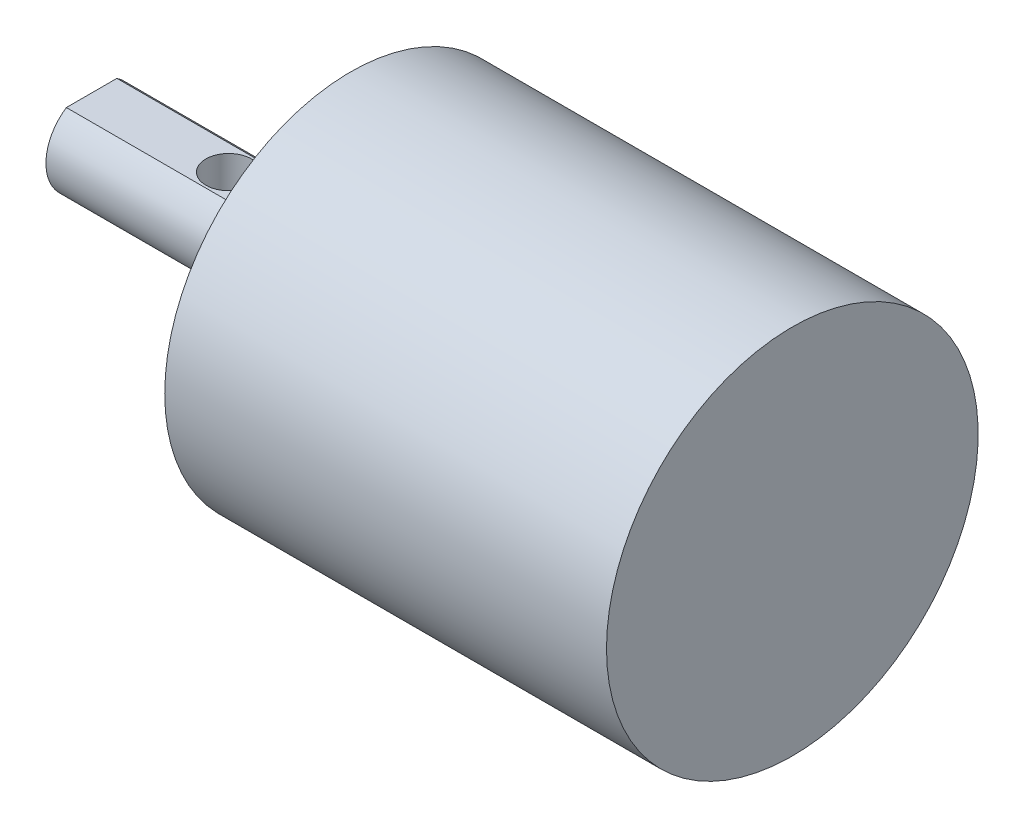
ISO-10303-21;
HEADER;
FILE_DESCRIPTION(('STEP AP214'),'2;1');
FILE_NAME('part.step','',(''),(''),'','','');
FILE_SCHEMA(('AUTOMOTIVE_DESIGN { 1 0 10303 214 1 1 1 1 }'));
ENDSEC;
DATA;
#1=APPLICATION_CONTEXT('core data for automotive mechanical design processes');
#2=APPLICATION_PROTOCOL_DEFINITION('international standard','automotive_design',2000,#1);
#3=PRODUCT_CONTEXT('',#1,'mechanical');
#4=PRODUCT('Part','Part','',(#3));
#5=PRODUCT_RELATED_PRODUCT_CATEGORY('part','',(#4));
#6=PRODUCT_DEFINITION_FORMATION('','',#4);
#7=PRODUCT_DEFINITION_CONTEXT('part definition',#1,'design');
#8=PRODUCT_DEFINITION('design','',#6,#7);
#9=PRODUCT_DEFINITION_SHAPE('','',#8);
#10=(LENGTH_UNIT() NAMED_UNIT(*) SI_UNIT(.MILLI.,.METRE.));
#11=(NAMED_UNIT(*) PLANE_ANGLE_UNIT() SI_UNIT($,.RADIAN.));
#12=(NAMED_UNIT(*) SI_UNIT($,.STERADIAN.) SOLID_ANGLE_UNIT());
#13=UNCERTAINTY_MEASURE_WITH_UNIT(LENGTH_MEASURE(1.E-05),#10,'distance_accuracy_value','');
#14=(GEOMETRIC_REPRESENTATION_CONTEXT(3) GLOBAL_UNCERTAINTY_ASSIGNED_CONTEXT((#13)) GLOBAL_UNIT_ASSIGNED_CONTEXT((#10,
#11,#12)) REPRESENTATION_CONTEXT('',''));
#15=CARTESIAN_POINT('',(0.,0.,0.));
#16=DIRECTION('',(0.,0.,1.));
#17=DIRECTION('',(1.,0.,0.));
#18=AXIS2_PLACEMENT_3D('',#15,#16,#17);
#19=CARTESIAN_POINT('',(-31.6,0.,-5.7));
#20=DIRECTION('',(-1.,0.,0.));
#21=DIRECTION('',(0.,0.,1.));
#22=AXIS2_PLACEMENT_3D('',#19,#20,#21);
#23=PLANE('',#22);
#24=CARTESIAN_POINT('',(-31.6,0.,-12.2));
#25=DIRECTION('',(-1.,0.,0.));
#26=DIRECTION('',(0.,0.,1.));
#27=AXIS2_PLACEMENT_3D('',#24,#25,#26);
#28=CIRCLE('',#27,6.5);
#29=CARTESIAN_POINT('',(-31.6,0.,-5.7));
#30=VERTEX_POINT('',#29);
#31=EDGE_CURVE('E234',#30,#30,#28,.T.);
#32=ORIENTED_EDGE('',*,*,#31,.T.);
#33=EDGE_LOOP('',(#32));
#34=FACE_BOUND('',#33,.T.);
#35=CARTESIAN_POINT('',(-31.6,0.,-12.2));
#36=DIRECTION('',(-1.,0.,0.));
#37=DIRECTION('',(0.,0.,1.));
#38=AXIS2_PLACEMENT_3D('',#35,#36,#37);
#39=CIRCLE('',#38,6.);
#40=CARTESIAN_POINT('',(-31.6,-6.,-12.2));
#41=VERTEX_POINT('',#40);
#42=CARTESIAN_POINT('',(-31.6,-1.5,-18.0094750193111));
#43=VERTEX_POINT('',#42);
#44=EDGE_CURVE('E270',#41,#43,#39,.T.);
#45=ORIENTED_EDGE('',*,*,#44,.F.);
#46=DIRECTION('',(0.,-0.866025403784439,-0.5));
#47=VECTOR('',#46,1.);
#48=CARTESIAN_POINT('',(-31.6,-1.5,-9.60192378864668));
#49=LINE('',#48,#47);
#50=CARTESIAN_POINT('',(-31.6,-1.5,-9.60192378864668));
#51=VERTEX_POINT('',#50);
#52=EDGE_CURVE('E132',#51,#41,#49,.T.);
#53=ORIENTED_EDGE('',*,*,#52,.F.);
#54=CARTESIAN_POINT('',(-31.6,0.,-12.2));
#55=DIRECTION('',(-1.,0.,0.));
#56=DIRECTION('',(0.,0.,1.));
#57=AXIS2_PLACEMENT_3D('',#54,#55,#56);
#58=CIRCLE('',#57,3.);
#59=CARTESIAN_POINT('',(-31.6,1.67021358881229,-14.692064719815));
#60=VERTEX_POINT('',#59);
#61=EDGE_CURVE('E238',#60,#51,#58,.T.);
#62=ORIENTED_EDGE('',*,*,#61,.F.);
#63=DIRECTION('',(0.,0.690885537617151,0.722964158109834));
#64=VECTOR('',#63,1.);
#65=CARTESIAN_POINT('',(-31.6,-1.5,-18.0094750193111));
#66=LINE('',#65,#64);
#67=EDGE_CURVE('E128',#43,#60,#66,.T.);
#68=ORIENTED_EDGE('',*,*,#67,.F.);
#69=EDGE_LOOP('',(#45,#53,#62,#68));
#70=FACE_BOUND('',#69,.T.);
#71=ADVANCED_FACE('F48',(#34,#70),#23,.T.);
#72=CARTESIAN_POINT('',(-46.,0.,-12.2));
#73=DIRECTION('',(-1.,0.,0.));
#74=DIRECTION('',(0.,0.,1.));
#75=AXIS2_PLACEMENT_3D('',#72,#73,#74);
#76=CYLINDRICAL_SURFACE('',#75,3.);
#77=DIRECTION('',(1.,0.,0.));
#78=VECTOR('',#77,1.);
#79=CARTESIAN_POINT('',(-32.1,-1.5,-9.60192378864668));
#80=LINE('',#79,#78);
#81=CARTESIAN_POINT('',(-32.1,-1.5,-9.60192378864668));
#82=VERTEX_POINT('',#81);
#83=EDGE_CURVE('E267',#82,#51,#80,.T.);
#84=ORIENTED_EDGE('',*,*,#83,.F.);
#85=CARTESIAN_POINT('',(-32.1,0.,-12.2));
#86=DIRECTION('',(1.,0.,0.));
#87=DIRECTION('',(0.,0.,-1.));
#88=AXIS2_PLACEMENT_3D('',#85,#86,#87);
#89=CIRCLE('',#88,3.);
#90=CARTESIAN_POINT('',(-32.1,1.67021358881229,-14.692064719815));
#91=VERTEX_POINT('',#90);
#92=EDGE_CURVE('E125',#91,#82,#89,.T.);
#93=ORIENTED_EDGE('',*,*,#92,.F.);
#94=DIRECTION('',(1.,0.,0.));
#95=VECTOR('',#94,1.);
#96=CARTESIAN_POINT('',(-32.1,1.67021358881229,-14.692064719815));
#97=LINE('',#96,#95);
#98=EDGE_CURVE('E139',#91,#60,#97,.T.);
#99=ORIENTED_EDGE('',*,*,#98,.T.);
#100=ORIENTED_EDGE('',*,*,#61,.T.);
#101=EDGE_LOOP('',(#84,#93,#99,#100));
#102=FACE_BOUND('',#101,.T.);
#103=CARTESIAN_POINT('',(-37.,-2.59807621135331,-10.7));
#104=CARTESIAN_POINT('',(-37.0781617122929,-2.59808302092688,-10.7000054553882));
#105=CARTESIAN_POINT('',(-37.1564221172876,-2.60165701781634,-10.7061500439002));
#106=CARTESIAN_POINT('',(-37.3105408970157,-2.61543549678078,-10.7304151851529));
#107=CARTESIAN_POINT('',(-37.3863938725651,-2.62565391083339,-10.7485609031687));
#108=CARTESIAN_POINT('',(-37.5331774965159,-2.65124019908097,-10.7958500769503));
#109=CARTESIAN_POINT('',(-37.6041319787104,-2.66658065209878,-10.8249350712594));
#110=CARTESIAN_POINT('',(-37.7401363029951,-2.70063997225286,-10.8930987119354));
#111=CARTESIAN_POINT('',(-37.8051858253937,-2.71935902214096,-10.9321778989463));
#112=CARTESIAN_POINT('',(-37.9334585928363,-2.75995303586162,-11.0230001892037));
#113=CARTESIAN_POINT('',(-37.9960887035103,-2.7819609545693,-11.0755219457843));
#114=CARTESIAN_POINT('',(-38.1121125826101,-2.82557974178558,-11.1901192885783));
#115=CARTESIAN_POINT('',(-38.1655017438753,-2.84719040746875,-11.2521996113266));
#116=CARTESIAN_POINT('',(-38.2650507267215,-2.88932215429424,-11.3892656548782));
#117=CARTESIAN_POINT('',(-38.3104806517893,-2.90967159627259,-11.4648392164811));
#118=CARTESIAN_POINT('',(-38.3877112798686,-2.94526134149294,-11.6237644601007));
#119=CARTESIAN_POINT('',(-38.4195205842058,-2.96050486775612,-11.7071111927928));
#120=CARTESIAN_POINT('',(-38.4662569919517,-2.98320691866356,-11.872932584111));
#121=CARTESIAN_POINT('',(-38.4822242895333,-2.99114220331338,-11.9550473142668));
#122=CARTESIAN_POINT('',(-38.5002491780126,-3.000113757691,-12.1211440569532));
#123=CARTESIAN_POINT('',(-38.5023151851936,-3.00115420176885,-12.2051249087656));
#124=CARTESIAN_POINT('',(-38.4928799890445,-2.99644472874675,-12.3647487866356));
#125=CARTESIAN_POINT('',(-38.4825429767182,-2.99127743838241,-12.4404817987652));
#126=CARTESIAN_POINT('',(-38.450678734143,-2.97561367889621,-12.5889706578775));
#127=CARTESIAN_POINT('',(-38.4291506665357,-2.96511681099591,-12.6617262816409));
#128=CARTESIAN_POINT('',(-38.3753761508653,-2.93957374931481,-12.8034640873543));
#129=CARTESIAN_POINT('',(-38.3429855302419,-2.92446662293799,-12.8723801352728));
#130=CARTESIAN_POINT('',(-38.2686048756978,-2.89106468980031,-13.00396520227));
#131=CARTESIAN_POINT('',(-38.2266114050465,-2.87276874236226,-13.066631973258));
#132=CARTESIAN_POINT('',(-38.1296569727005,-2.83266591598844,-13.1902604913473));
#133=CARTESIAN_POINT('',(-38.073845457511,-2.81069063997262,-13.250501112544));
#134=CARTESIAN_POINT('',(-37.9531154126047,-2.76681510880217,-13.3611565554467));
#135=CARTESIAN_POINT('',(-37.8881899415889,-2.74491492398443,-13.4115638173613));
#136=CARTESIAN_POINT('',(-37.7460277113639,-2.70216234138727,-13.5042580019633));
#137=CARTESIAN_POINT('',(-37.6682709654187,-2.68146479986061,-13.5458259724671));
#138=CARTESIAN_POINT('',(-37.5055934929615,-2.64563175417864,-13.6149786695018));
#139=CARTESIAN_POINT('',(-37.4206803504737,-2.63049045069101,-13.6425779873163));
#140=CARTESIAN_POINT('',(-37.2531782330758,-2.60916953725551,-13.6807703165376));
#141=CARTESIAN_POINT('',(-37.1709383214347,-2.60237483772744,-13.69253768318));
#142=CARTESIAN_POINT('',(-37.0053979877252,-2.59676879042414,-13.7022754199171));
#143=CARTESIAN_POINT('',(-36.9220983563203,-2.59795180333967,-13.7002555359725));
#144=CARTESIAN_POINT('',(-36.7665191221319,-2.60751504810877,-13.6835540650159));
#145=CARTESIAN_POINT('',(-36.6940308233381,-2.61509381259981,-13.6702817250687));
#146=CARTESIAN_POINT('',(-36.5524483205936,-2.63541032327012,-13.6335444269487));
#147=CARTESIAN_POINT('',(-36.4833552238801,-2.64814974007551,-13.6100761679354));
#148=CARTESIAN_POINT('',(-36.3468830036459,-2.67804333119485,-13.5524713829073));
#149=CARTESIAN_POINT('',(-36.2797314747197,-2.69537464864595,-13.5178910955391));
#150=CARTESIAN_POINT('',(-36.1517960926915,-2.73234179245874,-13.4394305960237));
#151=CARTESIAN_POINT('',(-36.0910155347301,-2.75197880032721,-13.3955456064983));
#152=CARTESIAN_POINT('',(-35.9695318487147,-2.79431997684504,-13.2932557507983));
#153=CARTESIAN_POINT('',(-35.9098042739235,-2.81709874731434,-13.2337179084724));
#154=CARTESIAN_POINT('',(-35.8008816430096,-2.86101352466839,-13.1051067430974));
#155=CARTESIAN_POINT('',(-35.7516901446542,-2.88214897511564,-13.036030211983));
#156=CARTESIAN_POINT('',(-35.6641394110748,-2.92112042536435,-12.8878030438381));
#157=CARTESIAN_POINT('',(-35.6261003226836,-2.93885462508044,-12.8084346463612));
#158=CARTESIAN_POINT('',(-35.5642931442139,-2.96825032438951,-12.6432835469616));
#159=CARTESIAN_POINT('',(-35.5405125229505,-2.9799171551456,-12.5575065520883));
#160=CARTESIAN_POINT('',(-35.509947153738,-2.99501262272824,-12.3904695234956));
#161=CARTESIAN_POINT('',(-35.5018031861858,-2.99909891862287,-12.3095171657757));
#162=CARTESIAN_POINT('',(-35.4987351018184,-3.00063195562697,-12.1473110210732));
#163=CARTESIAN_POINT('',(-35.5038063572146,-2.99808102100335,-12.0660573495574));
#164=CARTESIAN_POINT('',(-35.5261246101934,-2.98700953256884,-11.9111930115243));
#165=CARTESIAN_POINT('',(-35.5425472738865,-2.97889342001985,-11.8374315232831));
#166=CARTESIAN_POINT('',(-35.5859904989545,-2.95788140495135,-11.6938310717246));
#167=CARTESIAN_POINT('',(-35.6130125801402,-2.94498481699193,-11.6239926725667));
#168=CARTESIAN_POINT('',(-35.6780905782489,-2.9148889612218,-11.4868648906327));
#169=CARTESIAN_POINT('',(-35.7165689848118,-2.89752925798198,-11.4198122859499));
#170=CARTESIAN_POINT('',(-35.8029368962886,-2.86032199712739,-11.292838037279));
#171=CARTESIAN_POINT('',(-35.8508307236735,-2.84047329837541,-11.2329196888776));
#172=CARTESIAN_POINT('',(-35.9601957085341,-2.79792915339941,-11.1156289937647));
#173=CARTESIAN_POINT('',(-36.0225437312158,-2.77514698517547,-11.0591034731911));
#174=CARTESIAN_POINT('',(-36.1561760816947,-2.73094614244278,-10.957005068908));
#175=CARTESIAN_POINT('',(-36.2274682313015,-2.70952868642798,-10.9114418749849));
#176=CARTESIAN_POINT('',(-36.3799549698714,-2.66999407957374,-10.8313533803215));
#177=CARTESIAN_POINT('',(-36.4613912966931,-2.65200261384405,-10.7972224010586));
#178=CARTESIAN_POINT('',(-36.6299986065097,-2.62299234492527,-10.7436819357404));
#179=CARTESIAN_POINT('',(-36.717149333369,-2.61195024221553,-10.724223213237));
#180=CARTESIAN_POINT('',(-36.837708033478,-2.60293908902686,-10.7084494882034));
#181=CARTESIAN_POINT('',(-36.8700518415968,-2.60112193507727,-10.7052858425542));
#182=CARTESIAN_POINT('',(-36.9349247210234,-2.59868903831625,-10.701059892365));
#183=CARTESIAN_POINT('',(-36.9674538045788,-2.59807337587664,-10.6999977284002));
#184=CARTESIAN_POINT('',(-37.,-2.59807621135331,-10.7));
#185=B_SPLINE_CURVE_WITH_KNOTS('',3,(#103,#104,#105,#106,#107,#108,#109,#110,#111,#112,#113,
#114,#115,#116,#117,#118,#119,#120,#121,#122,#123,#124,#125,#126,#127,#128,#129,#130,#131,#132,
#133,#134,#135,#136,#137,#138,#139,#140,#141,#142,#143,#144,#145,#146,#147,#148,#149,#150,#151,
#152,#153,#154,#155,#156,#157,#158,#159,#160,#161,#162,#163,#164,#165,#166,#167,#168,#169,#170,
#171,#172,#173,#174,#175,#176,#177,#178,#179,#180,#181,#182,#183,#184),.UNSPECIFIED.,.T.,.F.,(4,
2,2,2,2,2,2,2,2,2,2,2,2,2,2,2,2,2,2,2,2,2,2,2,2,2,2,2,2,2,2,2,2,2,2,2,2,2,2,2,4),(0.,
0.234348183892079,0.469189339237211,0.70279289387832,0.936409088167718,1.18929346874735,
1.44230356626557,1.71236838358146,1.98226240445838,2.23295227451904,2.48349035529061,
2.71224146226808,2.94100968776184,3.17294302096721,3.40495949025409,3.65890787185338,
3.91305072368879,4.18333262594173,4.45333161317559,4.70193436281319,4.95036139782561,
5.17161275136041,5.39293578654097,5.62450944609134,5.85620229330073,6.11710115370922,
6.37808797467306,6.64596272119451,6.9136016971316,7.15668405584232,7.3996813019096,
7.62666637307241,7.85368400268022,8.0904112607921,8.32724745151081,8.58765362775104,
8.84828914267734,9.11716123557911,9.38512699504143,9.48270202777967,9.58028358741813),.UNSPECIFIED.);
#186=CARTESIAN_POINT('',(-37.,-2.59807621135331,-10.7));
#187=VERTEX_POINT('',#186);
#188=EDGE_CURVE('E160',#187,#187,#185,.T.);
#189=ORIENTED_EDGE('',*,*,#188,.F.);
#190=EDGE_LOOP('',(#189));
#191=FACE_BOUND('',#190,.T.);
#192=CARTESIAN_POINT('',(-46.,0.,-12.2));
#193=DIRECTION('',(-1.,0.,0.));
#194=DIRECTION('',(0.,0.,1.));
#195=AXIS2_PLACEMENT_3D('',#192,#193,#194);
#196=CIRCLE('',#195,3.);
#197=CARTESIAN_POINT('',(-46.,2.5,-13.8583123951777));
#198=VERTEX_POINT('',#197);
#199=CARTESIAN_POINT('',(-46.,2.5,-10.5416876048223));
#200=VERTEX_POINT('',#199);
#201=EDGE_CURVE('E241',#198,#200,#196,.T.);
#202=ORIENTED_EDGE('',*,*,#201,.F.);
#203=DIRECTION('',(-1.,0.,0.));
#204=VECTOR('',#203,1.);
#205=CARTESIAN_POINT('',(-34.5,2.5,-13.8583123951777));
#206=LINE('',#205,#204);
#207=CARTESIAN_POINT('',(-34.5,2.5,-13.8583123951777));
#208=VERTEX_POINT('',#207);
#209=EDGE_CURVE('E71',#208,#198,#206,.T.);
#210=ORIENTED_EDGE('',*,*,#209,.F.);
#211=CARTESIAN_POINT('',(-34.5,0.,-12.2));
#212=DIRECTION('',(-1.,0.,0.));
#213=DIRECTION('',(0.,0.,1.));
#214=AXIS2_PLACEMENT_3D('',#211,#212,#213);
#215=CIRCLE('',#214,3.00000000000002);
#216=CARTESIAN_POINT('',(-34.5,2.5,-10.5416876048223));
#217=VERTEX_POINT('',#216);
#218=EDGE_CURVE('E247',#217,#208,#215,.T.);
#219=ORIENTED_EDGE('',*,*,#218,.F.);
#220=DIRECTION('',(-1.,0.,0.));
#221=VECTOR('',#220,1.);
#222=CARTESIAN_POINT('',(-34.5,2.5,-10.5416876048223));
#223=LINE('',#222,#221);
#224=EDGE_CURVE('E244',#217,#200,#223,.T.);
#225=ORIENTED_EDGE('',*,*,#224,.T.);
#226=EDGE_LOOP('',(#202,#210,#219,#225));
#227=FACE_BOUND('',#226,.T.);
#228=ADVANCED_FACE('F170',(#102,#191,#227),#76,.T.);
#229=CARTESIAN_POINT('',(-46.,0.,-9.19999999999999));
#230=DIRECTION('',(-1.,0.,0.));
#231=DIRECTION('',(0.,0.,1.));
#232=AXIS2_PLACEMENT_3D('',#229,#230,#231);
#233=PLANE('',#232);
#234=CARTESIAN_POINT('',(-46.,0.,-12.2));
#235=DIRECTION('',(-1.,0.,0.));
#236=DIRECTION('',(0.,0.,1.));
#237=AXIS2_PLACEMENT_3D('',#234,#235,#236);
#238=CIRCLE('',#237,1.25);
#239=CARTESIAN_POINT('',(-46.,0.,-10.95));
#240=VERTEX_POINT('',#239);
#241=EDGE_CURVE('E168',#240,#240,#238,.T.);
#242=ORIENTED_EDGE('',*,*,#241,.F.);
#243=EDGE_LOOP('',(#242));
#244=FACE_BOUND('',#243,.T.);
#245=ORIENTED_EDGE('',*,*,#201,.T.);
#246=DIRECTION('',(0.,0.,-1.));
#247=VECTOR('',#246,1.);
#248=CARTESIAN_POINT('',(-46.,2.5,-12.2));
#249=LINE('',#248,#247);
#250=EDGE_CURVE('E249',#200,#198,#249,.T.);
#251=ORIENTED_EDGE('',*,*,#250,.T.);
#252=EDGE_LOOP('',(#245,#251));
#253=FACE_BOUND('',#252,.T.);
#254=ADVANCED_FACE('F198',(#244,#253),#233,.T.);
#255=CARTESIAN_POINT('',(0.,0.,-12.2));
#256=DIRECTION('',(1.,0.,0.));
#257=DIRECTION('',(0.,0.,-1.));
#258=AXIS2_PLACEMENT_3D('',#255,#256,#257);
#259=PLANE('',#258);
#260=CARTESIAN_POINT('',(0.,0.,-12.2));
#261=DIRECTION('',(-1.,0.,0.));
#262=DIRECTION('',(0.,0.,1.));
#263=AXIS2_PLACEMENT_3D('',#260,#261,#262);
#264=CIRCLE('',#263,12.2);
#265=CARTESIAN_POINT('',(0.,0.,0.));
#266=VERTEX_POINT('',#265);
#267=EDGE_CURVE('E13',#266,#266,#264,.T.);
#268=ORIENTED_EDGE('',*,*,#267,.F.);
#269=EDGE_LOOP('',(#268));
#270=FACE_BOUND('',#269,.T.);
#271=ADVANCED_FACE('F50',(#270),#259,.T.);
#272=CARTESIAN_POINT('',(-46.,0.,-12.2));
#273=DIRECTION('',(-1.,0.,0.));
#274=DIRECTION('',(0.,0.,1.));
#275=AXIS2_PLACEMENT_3D('',#272,#273,#274);
#276=CYLINDRICAL_SURFACE('',#275,12.2);
#277=ORIENTED_EDGE('',*,*,#267,.T.);
#278=EDGE_LOOP('',(#277));
#279=FACE_BOUND('',#278,.T.);
#280=CARTESIAN_POINT('',(-29.,0.,-12.2));
#281=DIRECTION('',(-1.,0.,0.));
#282=DIRECTION('',(0.,0.,1.));
#283=AXIS2_PLACEMENT_3D('',#280,#281,#282);
#284=CIRCLE('',#283,12.2);
#285=CARTESIAN_POINT('',(-29.,0.,0.));
#286=VERTEX_POINT('',#285);
#287=EDGE_CURVE('E56',#286,#286,#284,.T.);
#288=ORIENTED_EDGE('',*,*,#287,.F.);
#289=EDGE_LOOP('',(#288));
#290=FACE_BOUND('',#289,.T.);
#291=ADVANCED_FACE('F205',(#279,#290),#276,.T.);
#292=CARTESIAN_POINT('',(-29.,0.,0.));
#293=DIRECTION('',(-1.,0.,0.));
#294=DIRECTION('',(0.,0.,1.));
#295=AXIS2_PLACEMENT_3D('',#292,#293,#294);
#296=PLANE('',#295);
#297=CARTESIAN_POINT('',(-29.,9.5,-12.2));
#298=DIRECTION('',(-1.,0.,0.));
#299=DIRECTION('',(0.,0.,1.));
#300=AXIS2_PLACEMENT_3D('',#297,#298,#299);
#301=CIRCLE('',#300,1.25);
#302=CARTESIAN_POINT('',(-29.,9.5,-10.95));
#303=VERTEX_POINT('',#302);
#304=EDGE_CURVE('E134',#303,#303,#301,.T.);
#305=ORIENTED_EDGE('',*,*,#304,.F.);
#306=EDGE_LOOP('',(#305));
#307=FACE_BOUND('',#306,.T.);
#308=CARTESIAN_POINT('',(-29.,-4.75000000000016,-20.4272413359518));
#309=DIRECTION('',(-1.,0.,0.));
#310=DIRECTION('',(0.,0.,1.));
#311=AXIS2_PLACEMENT_3D('',#308,#309,#310);
#312=CIRCLE('',#311,1.25);
#313=CARTESIAN_POINT('',(-29.,-4.75000000000016,-19.1772413359518));
#314=VERTEX_POINT('',#313);
#315=EDGE_CURVE('E145',#314,#314,#312,.T.);
#316=ORIENTED_EDGE('',*,*,#315,.F.);
#317=EDGE_LOOP('',(#316));
#318=FACE_BOUND('',#317,.T.);
#319=CARTESIAN_POINT('',(-29.,-4.74999999999981,-3.97275866404745));
#320=DIRECTION('',(-1.,0.,0.));
#321=DIRECTION('',(0.,0.,1.));
#322=AXIS2_PLACEMENT_3D('',#319,#320,#321);
#323=CIRCLE('',#322,1.25);
#324=CARTESIAN_POINT('',(-29.,-4.74999999999981,-2.72275866404745));
#325=VERTEX_POINT('',#324);
#326=EDGE_CURVE('E151',#325,#325,#323,.T.);
#327=ORIENTED_EDGE('',*,*,#326,.F.);
#328=EDGE_LOOP('',(#327));
#329=FACE_BOUND('',#328,.T.);
#330=ORIENTED_EDGE('',*,*,#287,.T.);
#331=EDGE_LOOP('',(#330));
#332=FACE_BOUND('',#331,.T.);
#333=CARTESIAN_POINT('',(-29.,0.,-12.2));
#334=DIRECTION('',(-1.,0.,0.));
#335=DIRECTION('',(0.,0.,1.));
#336=AXIS2_PLACEMENT_3D('',#333,#334,#335);
#337=CIRCLE('',#336,6.5);
#338=CARTESIAN_POINT('',(-29.,0.,-5.7));
#339=VERTEX_POINT('',#338);
#340=EDGE_CURVE('E232',#339,#339,#337,.T.);
#341=ORIENTED_EDGE('',*,*,#340,.F.);
#342=EDGE_LOOP('',(#341));
#343=FACE_BOUND('',#342,.T.);
#344=ADVANCED_FACE('F219',(#307,#318,#329,#332,#343),#296,.T.);
#345=CARTESIAN_POINT('',(-46.,0.,-12.2));
#346=DIRECTION('',(-1.,0.,0.));
#347=DIRECTION('',(0.,0.,1.));
#348=AXIS2_PLACEMENT_3D('',#345,#346,#347);
#349=CYLINDRICAL_SURFACE('',#348,6.5);
#350=ORIENTED_EDGE('',*,*,#340,.T.);
#351=EDGE_LOOP('',(#350));
#352=FACE_BOUND('',#351,.T.);
#353=ORIENTED_EDGE('',*,*,#31,.F.);
#354=EDGE_LOOP('',(#353));
#355=FACE_BOUND('',#354,.T.);
#356=ADVANCED_FACE('F196',(#352,#355),#349,.T.);
#357=CARTESIAN_POINT('',(-34.5,2.5,-12.2));
#358=DIRECTION('',(0.,1.,0.));
#359=DIRECTION('',(0.,0.,1.));
#360=AXIS2_PLACEMENT_3D('',#357,#358,#359);
#361=PLANE('',#360);
#362=CARTESIAN_POINT('',(-37.,2.5,-12.2));
#363=DIRECTION('',(0.,1.,0.));
#364=DIRECTION('',(0.,0.,1.));
#365=AXIS2_PLACEMENT_3D('',#362,#363,#364);
#366=CIRCLE('',#365,1.5);
#367=CARTESIAN_POINT('',(-37.,2.5,-10.7));
#368=VERTEX_POINT('',#367);
#369=EDGE_CURVE('E157',#368,#368,#366,.T.);
#370=ORIENTED_EDGE('',*,*,#369,.F.);
#371=EDGE_LOOP('',(#370));
#372=FACE_BOUND('',#371,.T.);
#373=ORIENTED_EDGE('',*,*,#250,.F.);
#374=ORIENTED_EDGE('',*,*,#224,.F.);
#375=DIRECTION('',(0.,0.,1.));
#376=VECTOR('',#375,1.);
#377=CARTESIAN_POINT('',(-34.5,2.5,-12.2));
#378=LINE('',#377,#376);
#379=EDGE_CURVE('E251',#208,#217,#378,.T.);
#380=ORIENTED_EDGE('',*,*,#379,.F.);
#381=ORIENTED_EDGE('',*,*,#209,.T.);
#382=EDGE_LOOP('',(#373,#374,#380,#381));
#383=FACE_BOUND('',#382,.T.);
#384=ADVANCED_FACE('F193',(#372,#383),#361,.T.);
#385=CARTESIAN_POINT('',(-34.5,0.,-12.2));
#386=DIRECTION('',(-1.,0.,0.));
#387=DIRECTION('',(0.,0.,1.));
#388=AXIS2_PLACEMENT_3D('',#385,#386,#387);
#389=PLANE('',#388);
#390=ORIENTED_EDGE('',*,*,#379,.T.);
#391=ORIENTED_EDGE('',*,*,#218,.T.);
#392=EDGE_LOOP('',(#390,#391));
#393=FACE_BOUND('',#392,.T.);
#394=ADVANCED_FACE('F189',(#393),#389,.T.);
#395=CARTESIAN_POINT('',(-40.5,0.,-12.2));
#396=DIRECTION('',(-1.,0.,0.));
#397=DIRECTION('',(0.,0.,1.));
#398=AXIS2_PLACEMENT_3D('',#395,#396,#397);
#399=CONICAL_SURFACE('',#398,1.25,1.02974425867665);
#400=CARTESIAN_POINT('',(-39.7489242262155,0.,-12.2));
#401=VERTEX_POINT('',#400);
#402=VERTEX_LOOP('',#401);
#403=FACE_BOUND('',#402,.T.);
#404=CARTESIAN_POINT('',(-40.5,0.,-12.2));
#405=DIRECTION('',(-1.,0.,0.));
#406=DIRECTION('',(0.,0.,1.));
#407=AXIS2_PLACEMENT_3D('',#404,#405,#406);
#408=CIRCLE('',#407,1.25);
#409=CARTESIAN_POINT('',(-40.5,0.,-10.95));
#410=VERTEX_POINT('',#409);
#411=EDGE_CURVE('E252',#410,#410,#408,.T.);
#412=ORIENTED_EDGE('',*,*,#411,.T.);
#413=EDGE_LOOP('',(#412));
#414=FACE_BOUND('',#413,.T.);
#415=ADVANCED_FACE('F185',(#403,#414),#399,.F.);
#416=CARTESIAN_POINT('',(-46.,0.,-12.2));
#417=DIRECTION('',(-1.,0.,0.));
#418=DIRECTION('',(0.,0.,1.));
#419=AXIS2_PLACEMENT_3D('',#416,#417,#418);
#420=CYLINDRICAL_SURFACE('',#419,1.25);
#421=ORIENTED_EDGE('',*,*,#411,.F.);
#422=EDGE_LOOP('',(#421));
#423=FACE_BOUND('',#422,.T.);
#424=ORIENTED_EDGE('',*,*,#241,.T.);
#425=EDGE_LOOP('',(#424));
#426=FACE_BOUND('',#425,.T.);
#427=ADVANCED_FACE('F180',(#423,#426),#420,.F.);
#428=CARTESIAN_POINT('',(-37.,-9.,-12.2));
#429=DIRECTION('',(0.,1.,0.));
#430=DIRECTION('',(0.,0.,1.));
#431=AXIS2_PLACEMENT_3D('',#428,#429,#430);
#432=CYLINDRICAL_SURFACE('',#431,1.5);
#433=ORIENTED_EDGE('',*,*,#188,.T.);
#434=EDGE_LOOP('',(#433));
#435=FACE_BOUND('',#434,.T.);
#436=ORIENTED_EDGE('',*,*,#369,.T.);
#437=EDGE_LOOP('',(#436));
#438=FACE_BOUND('',#437,.T.);
#439=ADVANCED_FACE('F174',(#435,#438),#432,.F.);
#440=CARTESIAN_POINT('',(-25.,-4.74999999999981,-3.97275866404745));
#441=DIRECTION('',(-1.,0.,0.));
#442=DIRECTION('',(0.,0.,1.));
#443=AXIS2_PLACEMENT_3D('',#440,#441,#442);
#444=CONICAL_SURFACE('',#443,1.25,1.02974425867665);
#445=CARTESIAN_POINT('',(-24.2489242262155,-4.74999999999981,-3.97275866404745));
#446=VERTEX_POINT('',#445);
#447=VERTEX_LOOP('',#446);
#448=FACE_BOUND('',#447,.T.);
#449=CARTESIAN_POINT('',(-25.,-4.74999999999981,-3.97275866404745));
#450=DIRECTION('',(-1.,0.,0.));
#451=DIRECTION('',(0.,0.,1.));
#452=AXIS2_PLACEMENT_3D('',#449,#450,#451);
#453=CIRCLE('',#452,1.25);
#454=CARTESIAN_POINT('',(-25.,-4.74999999999981,-2.72275866404745));
#455=VERTEX_POINT('',#454);
#456=EDGE_CURVE('E154',#455,#455,#453,.T.);
#457=ORIENTED_EDGE('',*,*,#456,.T.);
#458=EDGE_LOOP('',(#457));
#459=FACE_BOUND('',#458,.T.);
#460=ADVANCED_FACE('F179',(#448,#459),#444,.F.);
#461=CARTESIAN_POINT('',(-29.,-4.74999999999981,-3.97275866404745));
#462=DIRECTION('',(-1.,0.,0.));
#463=DIRECTION('',(0.,0.,1.));
#464=AXIS2_PLACEMENT_3D('',#461,#462,#463);
#465=CYLINDRICAL_SURFACE('',#464,1.25);
#466=ORIENTED_EDGE('',*,*,#456,.F.);
#467=EDGE_LOOP('',(#466));
#468=FACE_BOUND('',#467,.T.);
#469=ORIENTED_EDGE('',*,*,#326,.T.);
#470=EDGE_LOOP('',(#469));
#471=FACE_BOUND('',#470,.T.);
#472=ADVANCED_FACE('F303',(#468,#471),#465,.F.);
#473=CARTESIAN_POINT('',(-25.,-4.75000000000016,-20.4272413359518));
#474=DIRECTION('',(-1.,0.,0.));
#475=DIRECTION('',(0.,0.,1.));
#476=AXIS2_PLACEMENT_3D('',#473,#474,#475);
#477=CONICAL_SURFACE('',#476,1.25,1.02974425867665);
#478=CARTESIAN_POINT('',(-24.2489242262155,-4.75000000000016,-20.4272413359518));
#479=VERTEX_POINT('',#478);
#480=VERTEX_LOOP('',#479);
#481=FACE_BOUND('',#480,.T.);
#482=CARTESIAN_POINT('',(-25.,-4.75000000000016,-20.4272413359518));
#483=DIRECTION('',(-1.,0.,0.));
#484=DIRECTION('',(0.,0.,1.));
#485=AXIS2_PLACEMENT_3D('',#482,#483,#484);
#486=CIRCLE('',#485,1.25);
#487=CARTESIAN_POINT('',(-25.,-4.75000000000016,-19.1772413359518));
#488=VERTEX_POINT('',#487);
#489=EDGE_CURVE('E148',#488,#488,#486,.T.);
#490=ORIENTED_EDGE('',*,*,#489,.T.);
#491=EDGE_LOOP('',(#490));
#492=FACE_BOUND('',#491,.T.);
#493=ADVANCED_FACE('F300',(#481,#492),#477,.F.);
#494=CARTESIAN_POINT('',(-29.,-4.75000000000016,-20.4272413359518));
#495=DIRECTION('',(-1.,0.,0.));
#496=DIRECTION('',(0.,0.,1.));
#497=AXIS2_PLACEMENT_3D('',#494,#495,#496);
#498=CYLINDRICAL_SURFACE('',#497,1.25);
#499=ORIENTED_EDGE('',*,*,#489,.F.);
#500=EDGE_LOOP('',(#499));
#501=FACE_BOUND('',#500,.T.);
#502=ORIENTED_EDGE('',*,*,#315,.T.);
#503=EDGE_LOOP('',(#502));
#504=FACE_BOUND('',#503,.T.);
#505=ADVANCED_FACE('F296',(#501,#504),#498,.F.);
#506=CARTESIAN_POINT('',(-25.,9.5,-12.2));
#507=DIRECTION('',(-1.,0.,0.));
#508=DIRECTION('',(0.,0.,1.));
#509=AXIS2_PLACEMENT_3D('',#506,#507,#508);
#510=CONICAL_SURFACE('',#509,1.25,1.02974425867665);
#511=CARTESIAN_POINT('',(-24.2489242262155,9.5,-12.2));
#512=VERTEX_POINT('',#511);
#513=VERTEX_LOOP('',#512);
#514=FACE_BOUND('',#513,.T.);
#515=CARTESIAN_POINT('',(-25.,9.5,-12.2));
#516=DIRECTION('',(-1.,0.,0.));
#517=DIRECTION('',(0.,0.,1.));
#518=AXIS2_PLACEMENT_3D('',#515,#516,#517);
#519=CIRCLE('',#518,1.25);
#520=CARTESIAN_POINT('',(-25.,9.5,-10.95));
#521=VERTEX_POINT('',#520);
#522=EDGE_CURVE('E137',#521,#521,#519,.T.);
#523=ORIENTED_EDGE('',*,*,#522,.T.);
#524=EDGE_LOOP('',(#523));
#525=FACE_BOUND('',#524,.T.);
#526=ADVANCED_FACE('F292',(#514,#525),#510,.F.);
#527=CARTESIAN_POINT('',(-29.,9.5,-12.2));
#528=DIRECTION('',(-1.,0.,0.));
#529=DIRECTION('',(0.,0.,1.));
#530=AXIS2_PLACEMENT_3D('',#527,#528,#529);
#531=CYLINDRICAL_SURFACE('',#530,1.25);
#532=ORIENTED_EDGE('',*,*,#522,.F.);
#533=EDGE_LOOP('',(#532));
#534=FACE_BOUND('',#533,.T.);
#535=ORIENTED_EDGE('',*,*,#304,.T.);
#536=EDGE_LOOP('',(#535));
#537=FACE_BOUND('',#536,.T.);
#538=ADVANCED_FACE('F289',(#534,#537),#531,.F.);
#539=CARTESIAN_POINT('',(-32.1,-1.5,-9.60192378864668));
#540=DIRECTION('',(0.,-0.5,0.866025403784439));
#541=DIRECTION('',(0.,-0.866025403784439,-0.5));
#542=AXIS2_PLACEMENT_3D('',#539,#540,#541);
#543=PLANE('',#542);
#544=ORIENTED_EDGE('',*,*,#52,.T.);
#545=DIRECTION('',(1.,0.,0.));
#546=VECTOR('',#545,1.);
#547=CARTESIAN_POINT('',(-32.1,-6.,-12.2));
#548=LINE('',#547,#546);
#549=CARTESIAN_POINT('',(-32.1,-6.,-12.2));
#550=VERTEX_POINT('',#549);
#551=EDGE_CURVE('E116',#550,#41,#548,.T.);
#552=ORIENTED_EDGE('',*,*,#551,.F.);
#553=DIRECTION('',(0.,-0.866025403784439,-0.5));
#554=VECTOR('',#553,1.);
#555=CARTESIAN_POINT('',(-32.1,-1.5,-9.60192378864668));
#556=LINE('',#555,#554);
#557=EDGE_CURVE('E120',#82,#550,#556,.T.);
#558=ORIENTED_EDGE('',*,*,#557,.F.);
#559=ORIENTED_EDGE('',*,*,#83,.T.);
#560=EDGE_LOOP('',(#544,#552,#558,#559));
#561=FACE_BOUND('',#560,.T.);
#562=ADVANCED_FACE('F130',(#561),#543,.F.);
#563=CARTESIAN_POINT('',(-32.1,0.,-12.2));
#564=DIRECTION('',(1.,0.,0.));
#565=DIRECTION('',(0.,0.,-1.));
#566=AXIS2_PLACEMENT_3D('',#563,#564,#565);
#567=CYLINDRICAL_SURFACE('',#566,6.);
#568=ORIENTED_EDGE('',*,*,#44,.T.);
#569=DIRECTION('',(1.,0.,0.));
#570=VECTOR('',#569,1.);
#571=CARTESIAN_POINT('',(-32.1,-1.5,-18.0094750193111));
#572=LINE('',#571,#570);
#573=CARTESIAN_POINT('',(-32.1,-1.5,-18.0094750193111));
#574=VERTEX_POINT('',#573);
#575=EDGE_CURVE('E63',#574,#43,#572,.T.);
#576=ORIENTED_EDGE('',*,*,#575,.F.);
#577=CARTESIAN_POINT('',(-32.1,0.,-12.2));
#578=DIRECTION('',(-1.,0.,0.));
#579=DIRECTION('',(0.,0.,1.));
#580=AXIS2_PLACEMENT_3D('',#577,#578,#579);
#581=CIRCLE('',#580,6.);
#582=EDGE_CURVE('E112',#550,#574,#581,.T.);
#583=ORIENTED_EDGE('',*,*,#582,.F.);
#584=ORIENTED_EDGE('',*,*,#551,.T.);
#585=EDGE_LOOP('',(#568,#576,#583,#584));
#586=FACE_BOUND('',#585,.T.);
#587=ADVANCED_FACE('F114',(#586),#567,.T.);
#588=CARTESIAN_POINT('',(-32.1,-1.5,-18.0094750193111));
#589=DIRECTION('',(0.,0.722964158109834,-0.690885537617151));
#590=DIRECTION('',(0.,0.690885537617151,0.722964158109834));
#591=AXIS2_PLACEMENT_3D('',#588,#589,#590);
#592=PLANE('',#591);
#593=ORIENTED_EDGE('',*,*,#67,.T.);
#594=ORIENTED_EDGE('',*,*,#98,.F.);
#595=DIRECTION('',(0.,0.690885537617151,0.722964158109834));
#596=VECTOR('',#595,1.);
#597=CARTESIAN_POINT('',(-32.1,-1.5,-18.0094750193111));
#598=LINE('',#597,#596);
#599=EDGE_CURVE('E119',#574,#91,#598,.T.);
#600=ORIENTED_EDGE('',*,*,#599,.F.);
#601=ORIENTED_EDGE('',*,*,#575,.T.);
#602=EDGE_LOOP('',(#593,#594,#600,#601));
#603=FACE_BOUND('',#602,.T.);
#604=ADVANCED_FACE('F277',(#603),#592,.F.);
#605=CARTESIAN_POINT('',(-32.1,0.,-12.2));
#606=DIRECTION('',(-1.,0.,0.));
#607=DIRECTION('',(0.,0.,1.));
#608=AXIS2_PLACEMENT_3D('',#605,#606,#607);
#609=PLANE('',#608);
#610=ORIENTED_EDGE('',*,*,#557,.T.);
#611=ORIENTED_EDGE('',*,*,#582,.T.);
#612=ORIENTED_EDGE('',*,*,#599,.T.);
#613=ORIENTED_EDGE('',*,*,#92,.T.);
#614=EDGE_LOOP('',(#610,#611,#612,#613));
#615=FACE_BOUND('',#614,.T.);
#616=ADVANCED_FACE('F123',(#615),#609,.T.);
#617=CLOSED_SHELL('',(#71,#228,#254,#271,#291,#344,#356,#384,#394,#415,#427,#439,#460,#472,#493,
#505,#526,#538,#562,#587,#604,#616));
#618=MANIFOLD_SOLID_BREP('B2',#617);
#619=ADVANCED_BREP_SHAPE_REPRESENTATION('',(#18,#618),#14);
#620=SHAPE_DEFINITION_REPRESENTATION(#9,#619);
ENDSEC;
END-ISO-10303-21;
